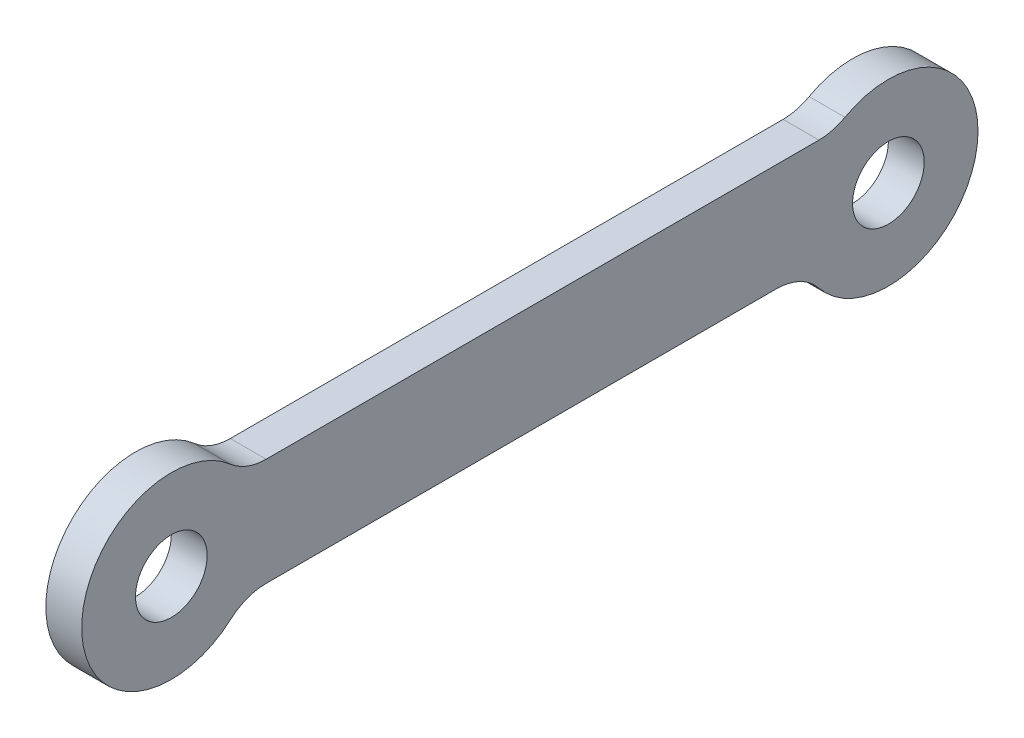
ISO-10303-21;
HEADER;
FILE_DESCRIPTION(('STEP AP214'),'2;1');
FILE_NAME('part.step','',(''),(''),'','','');
FILE_SCHEMA(('AUTOMOTIVE_DESIGN { 1 0 10303 214 1 1 1 1 }'));
ENDSEC;
DATA;
#1=APPLICATION_CONTEXT('core data for automotive mechanical design processes');
#2=APPLICATION_PROTOCOL_DEFINITION('international standard','automotive_design',2000,#1);
#3=PRODUCT_CONTEXT('',#1,'mechanical');
#4=PRODUCT('Part','Part','',(#3));
#5=PRODUCT_RELATED_PRODUCT_CATEGORY('part','',(#4));
#6=PRODUCT_DEFINITION_FORMATION('','',#4);
#7=PRODUCT_DEFINITION_CONTEXT('part definition',#1,'design');
#8=PRODUCT_DEFINITION('design','',#6,#7);
#9=PRODUCT_DEFINITION_SHAPE('','',#8);
#10=(LENGTH_UNIT() NAMED_UNIT(*) SI_UNIT(.MILLI.,.METRE.));
#11=(NAMED_UNIT(*) PLANE_ANGLE_UNIT() SI_UNIT($,.RADIAN.));
#12=(NAMED_UNIT(*) SI_UNIT($,.STERADIAN.) SOLID_ANGLE_UNIT());
#13=UNCERTAINTY_MEASURE_WITH_UNIT(LENGTH_MEASURE(1.E-05),#10,'distance_accuracy_value','');
#14=(GEOMETRIC_REPRESENTATION_CONTEXT(3) GLOBAL_UNCERTAINTY_ASSIGNED_CONTEXT((#13)) GLOBAL_UNIT_ASSIGNED_CONTEXT((#10,
#11,#12)) REPRESENTATION_CONTEXT('',''));
#15=CARTESIAN_POINT('',(0.,0.,0.));
#16=DIRECTION('',(0.,0.,1.));
#17=DIRECTION('',(1.,0.,0.));
#18=AXIS2_PLACEMENT_3D('',#15,#16,#17);
#19=CARTESIAN_POINT('',(0.,0.,0.));
#20=DIRECTION('',(1.,0.,0.));
#21=DIRECTION('',(0.,0.,-1.));
#22=AXIS2_PLACEMENT_3D('',#19,#20,#21);
#23=PLANE('',#22);
#24=CARTESIAN_POINT('',(0.,0.,0.));
#25=DIRECTION('',(1.,0.,0.));
#26=DIRECTION('',(0.,0.,-1.));
#27=AXIS2_PLACEMENT_3D('',#24,#25,#26);
#28=CIRCLE('',#27,2.);
#29=CARTESIAN_POINT('',(0.,0.,-2.));
#30=VERTEX_POINT('',#29);
#31=EDGE_CURVE('E270',#30,#30,#28,.T.);
#32=ORIENTED_EDGE('',*,*,#31,.T.);
#33=EDGE_LOOP('',(#32));
#34=FACE_BOUND('',#33,.T.);
#35=CARTESIAN_POINT('',(0.,-1.00000000000001,-40.));
#36=DIRECTION('',(1.,0.,0.));
#37=DIRECTION('',(0.,0.,-1.));
#38=AXIS2_PLACEMENT_3D('',#35,#36,#37);
#39=CIRCLE('',#38,2.);
#40=CARTESIAN_POINT('',(0.,-1.00000000000001,-42.));
#41=VERTEX_POINT('',#40);
#42=EDGE_CURVE('E273',#41,#41,#39,.T.);
#43=ORIENTED_EDGE('',*,*,#42,.T.);
#44=EDGE_LOOP('',(#43));
#45=FACE_BOUND('',#44,.T.);
#46=CARTESIAN_POINT('',(0.,0.,0.));
#47=DIRECTION('',(1.,0.,0.));
#48=DIRECTION('',(0.,0.,-1.));
#49=AXIS2_PLACEMENT_3D('',#46,#47,#48);
#50=CIRCLE('',#49,4.99999999999999);
#51=CARTESIAN_POINT('',(0.,3.74999999999999,-3.30718913883074));
#52=VERTEX_POINT('',#51);
#53=CARTESIAN_POINT('',(0.,-3.75,-3.30718913883072));
#54=VERTEX_POINT('',#53);
#55=EDGE_CURVE('E159',#52,#54,#50,.T.);
#56=ORIENTED_EDGE('',*,*,#55,.F.);
#57=CARTESIAN_POINT('',(0.,5.99999999999999,-5.29150262212918));
#58=DIRECTION('',(1.,0.,0.));
#59=DIRECTION('',(0.,0.,-1.));
#60=AXIS2_PLACEMENT_3D('',#57,#58,#59);
#61=CIRCLE('',#60,3.);
#62=CARTESIAN_POINT('',(0.,2.99999999999999,-5.29150262212918));
#63=VERTEX_POINT('',#62);
#64=EDGE_CURVE('E78',#52,#63,#61,.T.);
#65=ORIENTED_EDGE('',*,*,#64,.T.);
#66=DIRECTION('',(0.,0.,-1.));
#67=VECTOR('',#66,1.);
#68=CARTESIAN_POINT('',(0.,2.99999999999999,0.));
#69=LINE('',#68,#67);
#70=CARTESIAN_POINT('',(0.,2.99999999999999,-36.1270166537926));
#71=VERTEX_POINT('',#70);
#72=EDGE_CURVE('E286',#63,#71,#69,.T.);
#73=ORIENTED_EDGE('',*,*,#72,.T.);
#74=CARTESIAN_POINT('',(0.,5.99999999999999,-36.1270166537926));
#75=DIRECTION('',(1.,0.,0.));
#76=DIRECTION('',(0.,0.,-1.));
#77=AXIS2_PLACEMENT_3D('',#74,#75,#76);
#78=CIRCLE('',#77,3.);
#79=CARTESIAN_POINT('',(0.,3.375,-37.5793854086204));
#80=VERTEX_POINT('',#79);
#81=EDGE_CURVE('E85',#71,#80,#78,.T.);
#82=ORIENTED_EDGE('',*,*,#81,.T.);
#83=CARTESIAN_POINT('',(0.,-1.00000000000001,-40.));
#84=DIRECTION('',(1.,0.,0.));
#85=DIRECTION('',(0.,0.,-1.));
#86=AXIS2_PLACEMENT_3D('',#83,#84,#85);
#87=CIRCLE('',#86,5.);
#88=CARTESIAN_POINT('',(0.,-4.125,-36.096876251001));
#89=VERTEX_POINT('',#88);
#90=EDGE_CURVE('E272',#89,#80,#87,.T.);
#91=ORIENTED_EDGE('',*,*,#90,.F.);
#92=CARTESIAN_POINT('',(0.,-6.00000000000001,-33.7550020016016));
#93=DIRECTION('',(1.,0.,0.));
#94=DIRECTION('',(0.,0.,-1.));
#95=AXIS2_PLACEMENT_3D('',#92,#93,#94);
#96=CIRCLE('',#95,3.);
#97=CARTESIAN_POINT('',(0.,-3.00000000000001,-33.7550020016016));
#98=VERTEX_POINT('',#97);
#99=EDGE_CURVE('E147',#89,#98,#96,.T.);
#100=ORIENTED_EDGE('',*,*,#99,.T.);
#101=DIRECTION('',(0.,0.,-1.));
#102=VECTOR('',#101,1.);
#103=CARTESIAN_POINT('',(0.,-3.00000000000001,0.));
#104=LINE('',#103,#102);
#105=CARTESIAN_POINT('',(0.,-3.00000000000001,-5.29150262212916));
#106=VERTEX_POINT('',#105);
#107=EDGE_CURVE('E212',#106,#98,#104,.T.);
#108=ORIENTED_EDGE('',*,*,#107,.F.);
#109=CARTESIAN_POINT('',(0.,-6.00000000000001,-5.29150262212916));
#110=DIRECTION('',(1.,0.,0.));
#111=DIRECTION('',(0.,0.,-1.));
#112=AXIS2_PLACEMENT_3D('',#109,#110,#111);
#113=CIRCLE('',#112,3.);
#114=EDGE_CURVE('E148',#106,#54,#113,.T.);
#115=ORIENTED_EDGE('',*,*,#114,.T.);
#116=EDGE_LOOP('',(#56,#65,#73,#82,#91,#100,#108,#115));
#117=FACE_BOUND('',#116,.T.);
#118=ADVANCED_FACE('F69',(#34,#45,#117),#23,.F.);
#119=CARTESIAN_POINT('',(2.,0.,0.));
#120=DIRECTION('',(1.,0.,0.));
#121=DIRECTION('',(0.,0.,-1.));
#122=AXIS2_PLACEMENT_3D('',#119,#120,#121);
#123=PLANE('',#122);
#124=CARTESIAN_POINT('',(2.,0.,0.));
#125=DIRECTION('',(1.,0.,0.));
#126=DIRECTION('',(0.,0.,-1.));
#127=AXIS2_PLACEMENT_3D('',#124,#125,#126);
#128=CIRCLE('',#127,2.);
#129=CARTESIAN_POINT('',(2.,0.,-2.));
#130=VERTEX_POINT('',#129);
#131=EDGE_CURVE('E268',#130,#130,#128,.T.);
#132=ORIENTED_EDGE('',*,*,#131,.F.);
#133=EDGE_LOOP('',(#132));
#134=FACE_BOUND('',#133,.T.);
#135=CARTESIAN_POINT('',(2.,-1.00000000000001,-40.));
#136=DIRECTION('',(1.,0.,0.));
#137=DIRECTION('',(0.,0.,-1.));
#138=AXIS2_PLACEMENT_3D('',#135,#136,#137);
#139=CIRCLE('',#138,2.);
#140=CARTESIAN_POINT('',(2.,-1.00000000000001,-42.));
#141=VERTEX_POINT('',#140);
#142=EDGE_CURVE('E295',#141,#141,#139,.T.);
#143=ORIENTED_EDGE('',*,*,#142,.F.);
#144=EDGE_LOOP('',(#143));
#145=FACE_BOUND('',#144,.T.);
#146=DIRECTION('',(0.,0.,-1.));
#147=VECTOR('',#146,1.);
#148=CARTESIAN_POINT('',(2.,-3.00000000000001,0.));
#149=LINE('',#148,#147);
#150=CARTESIAN_POINT('',(2.,-3.00000000000001,-5.29150262212916));
#151=VERTEX_POINT('',#150);
#152=CARTESIAN_POINT('',(2.,-3.00000000000001,-33.7550020016016));
#153=VERTEX_POINT('',#152);
#154=EDGE_CURVE('E139',#151,#153,#149,.T.);
#155=ORIENTED_EDGE('',*,*,#154,.T.);
#156=CARTESIAN_POINT('',(2.,-6.00000000000001,-33.7550020016016));
#157=DIRECTION('',(1.,0.,0.));
#158=DIRECTION('',(0.,0.,-1.));
#159=AXIS2_PLACEMENT_3D('',#156,#157,#158);
#160=CIRCLE('',#159,3.);
#161=CARTESIAN_POINT('',(2.,-4.125,-36.096876251001));
#162=VERTEX_POINT('',#161);
#163=EDGE_CURVE('E193',#153,#162,#160,.F.);
#164=ORIENTED_EDGE('',*,*,#163,.T.);
#165=CARTESIAN_POINT('',(2.,-1.00000000000001,-40.));
#166=DIRECTION('',(1.,0.,0.));
#167=DIRECTION('',(0.,0.,-1.));
#168=AXIS2_PLACEMENT_3D('',#165,#166,#167);
#169=CIRCLE('',#168,5.);
#170=CARTESIAN_POINT('',(2.,3.375,-37.5793854086204));
#171=VERTEX_POINT('',#170);
#172=EDGE_CURVE('E207',#162,#171,#169,.T.);
#173=ORIENTED_EDGE('',*,*,#172,.T.);
#174=CARTESIAN_POINT('',(2.,5.99999999999999,-36.1270166537926));
#175=DIRECTION('',(1.,0.,0.));
#176=DIRECTION('',(0.,0.,-1.));
#177=AXIS2_PLACEMENT_3D('',#174,#175,#176);
#178=CIRCLE('',#177,3.);
#179=CARTESIAN_POINT('',(2.,2.99999999999999,-36.1270166537926));
#180=VERTEX_POINT('',#179);
#181=EDGE_CURVE('E198',#171,#180,#178,.F.);
#182=ORIENTED_EDGE('',*,*,#181,.T.);
#183=DIRECTION('',(0.,0.,-1.));
#184=VECTOR('',#183,1.);
#185=CARTESIAN_POINT('',(2.,2.99999999999999,0.));
#186=LINE('',#185,#184);
#187=CARTESIAN_POINT('',(2.,2.99999999999999,-5.29150262212918));
#188=VERTEX_POINT('',#187);
#189=EDGE_CURVE('E160',#188,#180,#186,.T.);
#190=ORIENTED_EDGE('',*,*,#189,.F.);
#191=CARTESIAN_POINT('',(2.,5.99999999999999,-5.29150262212918));
#192=DIRECTION('',(1.,0.,0.));
#193=DIRECTION('',(0.,0.,-1.));
#194=AXIS2_PLACEMENT_3D('',#191,#192,#193);
#195=CIRCLE('',#194,3.);
#196=CARTESIAN_POINT('',(2.,3.74999999999999,-3.30718913883074));
#197=VERTEX_POINT('',#196);
#198=EDGE_CURVE('E12',#188,#197,#195,.F.);
#199=ORIENTED_EDGE('',*,*,#198,.T.);
#200=CARTESIAN_POINT('',(2.,0.,0.));
#201=DIRECTION('',(1.,0.,0.));
#202=DIRECTION('',(0.,0.,-1.));
#203=AXIS2_PLACEMENT_3D('',#200,#201,#202);
#204=CIRCLE('',#203,4.99999999999999);
#205=CARTESIAN_POINT('',(2.,-3.75,-3.30718913883072));
#206=VERTEX_POINT('',#205);
#207=EDGE_CURVE('E142',#197,#206,#204,.T.);
#208=ORIENTED_EDGE('',*,*,#207,.T.);
#209=CARTESIAN_POINT('',(2.,-6.00000000000001,-5.29150262212916));
#210=DIRECTION('',(1.,0.,0.));
#211=DIRECTION('',(0.,0.,-1.));
#212=AXIS2_PLACEMENT_3D('',#209,#210,#211);
#213=CIRCLE('',#212,3.);
#214=EDGE_CURVE('E136',#206,#151,#213,.F.);
#215=ORIENTED_EDGE('',*,*,#214,.T.);
#216=EDGE_LOOP('',(#155,#164,#173,#182,#190,#199,#208,#215));
#217=FACE_BOUND('',#216,.T.);
#218=ADVANCED_FACE('F138',(#134,#145,#217),#123,.T.);
#219=CARTESIAN_POINT('',(2.,0.,0.));
#220=DIRECTION('',(-1.,0.,0.));
#221=DIRECTION('',(0.,0.,1.));
#222=AXIS2_PLACEMENT_3D('',#219,#220,#221);
#223=CYLINDRICAL_SURFACE('',#222,4.99999999999999);
#224=ORIENTED_EDGE('',*,*,#55,.T.);
#225=DIRECTION('',(-1.,0.,0.));
#226=VECTOR('',#225,1.);
#227=CARTESIAN_POINT('',(2.,-3.75,-3.30718913883072));
#228=LINE('',#227,#226);
#229=EDGE_CURVE('E169',#54,#206,#228,.F.);
#230=ORIENTED_EDGE('',*,*,#229,.T.);
#231=ORIENTED_EDGE('',*,*,#207,.F.);
#232=DIRECTION('',(-1.,0.,0.));
#233=VECTOR('',#232,1.);
#234=CARTESIAN_POINT('',(2.,3.74999999999999,-3.30718913883074));
#235=LINE('',#234,#233);
#236=EDGE_CURVE('E164',#197,#52,#235,.T.);
#237=ORIENTED_EDGE('',*,*,#236,.T.);
#238=EDGE_LOOP('',(#224,#230,#231,#237));
#239=FACE_BOUND('',#238,.T.);
#240=ADVANCED_FACE('F227',(#239),#223,.T.);
#241=CARTESIAN_POINT('',(2.,-1.00000000000001,-40.));
#242=DIRECTION('',(-1.,0.,0.));
#243=DIRECTION('',(0.,0.,1.));
#244=AXIS2_PLACEMENT_3D('',#241,#242,#243);
#245=CYLINDRICAL_SURFACE('',#244,5.);
#246=ORIENTED_EDGE('',*,*,#172,.F.);
#247=DIRECTION('',(-1.,0.,0.));
#248=VECTOR('',#247,1.);
#249=CARTESIAN_POINT('',(2.,-4.12500000000001,-36.096876251001));
#250=LINE('',#249,#248);
#251=EDGE_CURVE('E179',#162,#89,#250,.T.);
#252=ORIENTED_EDGE('',*,*,#251,.T.);
#253=ORIENTED_EDGE('',*,*,#90,.T.);
#254=DIRECTION('',(-1.,0.,0.));
#255=VECTOR('',#254,1.);
#256=CARTESIAN_POINT('',(2.,3.375,-37.5793854086204));
#257=LINE('',#256,#255);
#258=EDGE_CURVE('E176',#80,#171,#257,.F.);
#259=ORIENTED_EDGE('',*,*,#258,.T.);
#260=EDGE_LOOP('',(#246,#252,#253,#259));
#261=FACE_BOUND('',#260,.T.);
#262=ADVANCED_FACE('F234',(#261),#245,.T.);
#263=CARTESIAN_POINT('',(2.,2.99999999999999,0.));
#264=DIRECTION('',(0.,1.,0.));
#265=DIRECTION('',(0.,0.,1.));
#266=AXIS2_PLACEMENT_3D('',#263,#264,#265);
#267=PLANE('',#266);
#268=ORIENTED_EDGE('',*,*,#189,.T.);
#269=DIRECTION('',(-1.,0.,0.));
#270=VECTOR('',#269,1.);
#271=CARTESIAN_POINT('',(2.,2.99999999999999,-36.1270166537926));
#272=LINE('',#271,#270);
#273=EDGE_CURVE('E186',#180,#71,#272,.T.);
#274=ORIENTED_EDGE('',*,*,#273,.T.);
#275=ORIENTED_EDGE('',*,*,#72,.F.);
#276=DIRECTION('',(-1.,0.,0.));
#277=VECTOR('',#276,1.);
#278=CARTESIAN_POINT('',(2.,2.99999999999999,-5.29150262212918));
#279=LINE('',#278,#277);
#280=EDGE_CURVE('E183',#63,#188,#279,.F.);
#281=ORIENTED_EDGE('',*,*,#280,.T.);
#282=EDGE_LOOP('',(#268,#274,#275,#281));
#283=FACE_BOUND('',#282,.T.);
#284=ADVANCED_FACE('F209',(#283),#267,.T.);
#285=CARTESIAN_POINT('',(2.,-3.00000000000001,0.));
#286=DIRECTION('',(0.,1.,0.));
#287=DIRECTION('',(0.,0.,1.));
#288=AXIS2_PLACEMENT_3D('',#285,#286,#287);
#289=PLANE('',#288);
#290=ORIENTED_EDGE('',*,*,#154,.F.);
#291=DIRECTION('',(1.,0.,0.));
#292=VECTOR('',#291,1.);
#293=CARTESIAN_POINT('',(0.,-3.00000000000001,-5.29150262212916));
#294=LINE('',#293,#292);
#295=EDGE_CURVE('E154',#151,#106,#294,.F.);
#296=ORIENTED_EDGE('',*,*,#295,.T.);
#297=ORIENTED_EDGE('',*,*,#107,.T.);
#298=DIRECTION('',(1.,0.,0.));
#299=VECTOR('',#298,1.);
#300=CARTESIAN_POINT('',(2.,-3.00000000000001,-33.7550020016016));
#301=LINE('',#300,#299);
#302=EDGE_CURVE('E157',#98,#153,#301,.T.);
#303=ORIENTED_EDGE('',*,*,#302,.T.);
#304=EDGE_LOOP('',(#290,#296,#297,#303));
#305=FACE_BOUND('',#304,.T.);
#306=ADVANCED_FACE('F152',(#305),#289,.F.);
#307=CARTESIAN_POINT('',(-1.2E-05,-1.00000000000001,-40.));
#308=DIRECTION('',(1.,0.,0.));
#309=DIRECTION('',(0.,0.,-1.));
#310=AXIS2_PLACEMENT_3D('',#307,#308,#309);
#311=CYLINDRICAL_SURFACE('',#310,2.);
#312=CARTESIAN_POINT('',(2.,-1.00000000000001,-42.));
#313=CARTESIAN_POINT('',(1.97916666666667,-1.00000000000001,-42.));
#314=CARTESIAN_POINT('',(1.95833333333333,-1.00000000000001,-42.));
#315=CARTESIAN_POINT('',(1.91666666666667,-1.00000000000001,-42.));
#316=CARTESIAN_POINT('',(1.89583333333333,-1.00000000000001,-42.));
#317=CARTESIAN_POINT('',(1.85416666666667,-1.00000000000001,-42.));
#318=CARTESIAN_POINT('',(1.83333333333333,-1.00000000000001,-42.));
#319=CARTESIAN_POINT('',(1.79166666666667,-1.00000000000001,-42.));
#320=CARTESIAN_POINT('',(1.77083333333333,-1.00000000000001,-42.));
#321=CARTESIAN_POINT('',(1.72916666666667,-1.00000000000001,-42.));
#322=CARTESIAN_POINT('',(1.70833333333333,-1.00000000000001,-42.));
#323=CARTESIAN_POINT('',(1.66666666666667,-1.00000000000001,-42.));
#324=CARTESIAN_POINT('',(1.64583333333333,-1.00000000000001,-42.));
#325=CARTESIAN_POINT('',(1.60416666666667,-1.00000000000001,-42.));
#326=CARTESIAN_POINT('',(1.58333333333333,-1.00000000000001,-42.));
#327=CARTESIAN_POINT('',(1.54166666666667,-1.00000000000001,-42.));
#328=CARTESIAN_POINT('',(1.52083333333333,-1.00000000000001,-42.));
#329=CARTESIAN_POINT('',(1.47916666666667,-1.00000000000001,-42.));
#330=CARTESIAN_POINT('',(1.45833333333333,-1.00000000000001,-42.));
#331=CARTESIAN_POINT('',(1.41666666666667,-1.00000000000001,-42.));
#332=CARTESIAN_POINT('',(1.39583333333333,-1.00000000000001,-42.));
#333=CARTESIAN_POINT('',(1.35416666666667,-1.00000000000001,-42.));
#334=CARTESIAN_POINT('',(1.33333333333333,-1.00000000000001,-42.));
#335=CARTESIAN_POINT('',(1.29166666666667,-1.00000000000001,-42.));
#336=CARTESIAN_POINT('',(1.27083333333333,-1.00000000000001,-42.));
#337=CARTESIAN_POINT('',(1.22916666666667,-1.00000000000001,-42.));
#338=CARTESIAN_POINT('',(1.20833333333333,-1.00000000000001,-42.));
#339=CARTESIAN_POINT('',(1.16666666666667,-1.00000000000001,-42.));
#340=CARTESIAN_POINT('',(1.14583333333333,-1.00000000000001,-42.));
#341=CARTESIAN_POINT('',(1.10416666666667,-1.00000000000001,-42.));
#342=CARTESIAN_POINT('',(1.08333333333333,-1.00000000000001,-42.));
#343=CARTESIAN_POINT('',(1.04166666666667,-1.00000000000001,-42.));
#344=CARTESIAN_POINT('',(1.02083333333333,-1.00000000000001,-42.));
#345=CARTESIAN_POINT('',(0.979166666666667,-1.00000000000001,-42.));
#346=CARTESIAN_POINT('',(0.958333333333334,-1.00000000000001,-42.));
#347=CARTESIAN_POINT('',(0.916666666666667,-1.00000000000001,-42.));
#348=CARTESIAN_POINT('',(0.895833333333334,-1.00000000000001,-42.));
#349=CARTESIAN_POINT('',(0.854166666666667,-1.00000000000001,-42.));
#350=CARTESIAN_POINT('',(0.833333333333334,-1.00000000000001,-42.));
#351=CARTESIAN_POINT('',(0.791666666666667,-1.00000000000001,-42.));
#352=CARTESIAN_POINT('',(0.770833333333334,-1.00000000000001,-42.));
#353=CARTESIAN_POINT('',(0.729166666666667,-1.00000000000001,-42.));
#354=CARTESIAN_POINT('',(0.708333333333334,-1.00000000000001,-42.));
#355=CARTESIAN_POINT('',(0.666666666666667,-1.00000000000001,-42.));
#356=CARTESIAN_POINT('',(0.645833333333334,-1.00000000000001,-42.));
#357=CARTESIAN_POINT('',(0.604166666666667,-1.00000000000001,-42.));
#358=CARTESIAN_POINT('',(0.583333333333333,-1.00000000000001,-42.));
#359=CARTESIAN_POINT('',(0.541666666666667,-1.00000000000001,-42.));
#360=CARTESIAN_POINT('',(0.520833333333333,-1.00000000000001,-42.));
#361=CARTESIAN_POINT('',(0.479166666666667,-1.00000000000001,-42.));
#362=CARTESIAN_POINT('',(0.458333333333334,-1.00000000000001,-42.));
#363=CARTESIAN_POINT('',(0.416666666666667,-1.00000000000001,-42.));
#364=CARTESIAN_POINT('',(0.395833333333334,-1.00000000000001,-42.));
#365=CARTESIAN_POINT('',(0.354166666666667,-1.00000000000001,-42.));
#366=CARTESIAN_POINT('',(0.333333333333334,-1.00000000000001,-42.));
#367=CARTESIAN_POINT('',(0.291666666666667,-1.00000000000001,-42.));
#368=CARTESIAN_POINT('',(0.270833333333333,-1.00000000000001,-42.));
#369=CARTESIAN_POINT('',(0.229166666666667,-1.00000000000001,-42.));
#370=CARTESIAN_POINT('',(0.208333333333333,-1.00000000000001,-42.));
#371=CARTESIAN_POINT('',(0.166666666666667,-1.00000000000001,-42.));
#372=CARTESIAN_POINT('',(0.145833333333334,-1.00000000000001,-42.));
#373=CARTESIAN_POINT('',(0.104166666666667,-1.00000000000001,-42.));
#374=CARTESIAN_POINT('',(0.0833333333333336,-1.00000000000001,-42.));
#375=CARTESIAN_POINT('',(0.0416666666666669,-1.00000000000001,-42.));
#376=CARTESIAN_POINT('',(0.0208333333333335,-1.00000000000001,-42.));
#377=CARTESIAN_POINT('',(0.,-1.00000000000001,-42.));
#378=B_SPLINE_CURVE_WITH_KNOTS('',3,(#312,#313,#314,#315,#316,#317,#318,#319,#320,#321,#322,
#323,#324,#325,#326,#327,#328,#329,#330,#331,#332,#333,#334,#335,#336,#337,#338,#339,#340,#341,
#342,#343,#344,#345,#346,#347,#348,#349,#350,#351,#352,#353,#354,#355,#356,#357,#358,#359,#360,
#361,#362,#363,#364,#365,#366,#367,#368,#369,#370,#371,#372,#373,#374,#375,#376,#377),
.UNSPECIFIED.,.F.,.F.,(4,2,2,2,2,2,2,2,2,2,2,2,2,2,2,2,2,2,2,2,2,2,2,2,2,2,2,2,2,2,2,2,4),(0.,
0.0624999999999996,0.125,0.1875,0.25,0.3125,0.375,0.4375,0.5,0.5625,0.625,0.6875,0.75,0.8125,
0.875,0.9375,1.,1.0625,1.125,1.1875,1.25,1.3125,1.375,1.4375,1.5,1.5625,1.625,1.6875,1.75,
1.8125,1.875,1.9375,2.),.UNSPECIFIED.);
#379=EDGE_CURVE('BSEAM233',#141,#41,#378,.T.);
#380=ORIENTED_EDGE('',*,*,#142,.T.);
#381=ORIENTED_EDGE('',*,*,#42,.F.);
#382=ORIENTED_EDGE('',*,*,#379,.T.);
#383=ORIENTED_EDGE('',*,*,#379,.F.);
#384=EDGE_LOOP('',(#380,#382,#381,#383));
#385=FACE_BOUND('',#384,.T.);
#386=ADVANCED_FACE('F233',(#385),#311,.F.);
#387=CARTESIAN_POINT('',(-1.2E-05,0.,0.));
#388=DIRECTION('',(1.,0.,0.));
#389=DIRECTION('',(0.,0.,-1.));
#390=AXIS2_PLACEMENT_3D('',#387,#388,#389);
#391=CYLINDRICAL_SURFACE('',#390,2.);
#392=CARTESIAN_POINT('',(2.,0.,-2.));
#393=CARTESIAN_POINT('',(1.97916666666667,0.,-2.));
#394=CARTESIAN_POINT('',(1.95833333333333,0.,-2.));
#395=CARTESIAN_POINT('',(1.91666666666667,0.,-2.));
#396=CARTESIAN_POINT('',(1.89583333333333,0.,-2.));
#397=CARTESIAN_POINT('',(1.85416666666667,0.,-2.));
#398=CARTESIAN_POINT('',(1.83333333333333,0.,-2.));
#399=CARTESIAN_POINT('',(1.79166666666667,0.,-2.));
#400=CARTESIAN_POINT('',(1.77083333333333,0.,-2.));
#401=CARTESIAN_POINT('',(1.72916666666667,0.,-2.));
#402=CARTESIAN_POINT('',(1.70833333333333,0.,-2.));
#403=CARTESIAN_POINT('',(1.66666666666667,0.,-2.));
#404=CARTESIAN_POINT('',(1.64583333333333,0.,-2.));
#405=CARTESIAN_POINT('',(1.60416666666667,0.,-2.));
#406=CARTESIAN_POINT('',(1.58333333333333,0.,-2.));
#407=CARTESIAN_POINT('',(1.54166666666667,0.,-2.));
#408=CARTESIAN_POINT('',(1.52083333333333,0.,-2.));
#409=CARTESIAN_POINT('',(1.47916666666667,0.,-2.));
#410=CARTESIAN_POINT('',(1.45833333333333,0.,-2.));
#411=CARTESIAN_POINT('',(1.41666666666667,0.,-2.));
#412=CARTESIAN_POINT('',(1.39583333333333,0.,-2.));
#413=CARTESIAN_POINT('',(1.35416666666667,0.,-2.));
#414=CARTESIAN_POINT('',(1.33333333333333,0.,-2.));
#415=CARTESIAN_POINT('',(1.29166666666667,0.,-2.));
#416=CARTESIAN_POINT('',(1.27083333333333,0.,-2.));
#417=CARTESIAN_POINT('',(1.22916666666667,0.,-2.));
#418=CARTESIAN_POINT('',(1.20833333333333,0.,-2.));
#419=CARTESIAN_POINT('',(1.16666666666667,0.,-2.));
#420=CARTESIAN_POINT('',(1.14583333333333,0.,-2.));
#421=CARTESIAN_POINT('',(1.10416666666667,0.,-2.));
#422=CARTESIAN_POINT('',(1.08333333333333,0.,-2.));
#423=CARTESIAN_POINT('',(1.04166666666667,0.,-2.));
#424=CARTESIAN_POINT('',(1.02083333333333,0.,-2.));
#425=CARTESIAN_POINT('',(0.979166666666667,0.,-2.));
#426=CARTESIAN_POINT('',(0.958333333333334,0.,-2.));
#427=CARTESIAN_POINT('',(0.916666666666667,0.,-2.));
#428=CARTESIAN_POINT('',(0.895833333333334,0.,-2.));
#429=CARTESIAN_POINT('',(0.854166666666667,0.,-2.));
#430=CARTESIAN_POINT('',(0.833333333333334,0.,-2.));
#431=CARTESIAN_POINT('',(0.791666666666667,0.,-2.));
#432=CARTESIAN_POINT('',(0.770833333333334,0.,-2.));
#433=CARTESIAN_POINT('',(0.729166666666667,0.,-2.));
#434=CARTESIAN_POINT('',(0.708333333333334,0.,-2.));
#435=CARTESIAN_POINT('',(0.666666666666667,0.,-2.));
#436=CARTESIAN_POINT('',(0.645833333333334,0.,-2.));
#437=CARTESIAN_POINT('',(0.604166666666667,0.,-2.));
#438=CARTESIAN_POINT('',(0.583333333333333,0.,-2.));
#439=CARTESIAN_POINT('',(0.541666666666667,0.,-2.));
#440=CARTESIAN_POINT('',(0.520833333333333,0.,-2.));
#441=CARTESIAN_POINT('',(0.479166666666667,0.,-2.));
#442=CARTESIAN_POINT('',(0.458333333333334,0.,-2.));
#443=CARTESIAN_POINT('',(0.416666666666667,0.,-2.));
#444=CARTESIAN_POINT('',(0.395833333333334,0.,-2.));
#445=CARTESIAN_POINT('',(0.354166666666667,0.,-2.));
#446=CARTESIAN_POINT('',(0.333333333333334,0.,-2.));
#447=CARTESIAN_POINT('',(0.291666666666667,0.,-2.));
#448=CARTESIAN_POINT('',(0.270833333333333,0.,-2.));
#449=CARTESIAN_POINT('',(0.229166666666667,0.,-2.));
#450=CARTESIAN_POINT('',(0.208333333333333,0.,-2.));
#451=CARTESIAN_POINT('',(0.166666666666667,0.,-2.));
#452=CARTESIAN_POINT('',(0.145833333333334,0.,-2.));
#453=CARTESIAN_POINT('',(0.104166666666667,0.,-2.));
#454=CARTESIAN_POINT('',(0.0833333333333336,0.,-2.));
#455=CARTESIAN_POINT('',(0.0416666666666669,0.,-2.));
#456=CARTESIAN_POINT('',(0.0208333333333335,0.,-2.));
#457=CARTESIAN_POINT('',(0.,0.,-2.));
#458=B_SPLINE_CURVE_WITH_KNOTS('',3,(#392,#393,#394,#395,#396,#397,#398,#399,#400,#401,#402,
#403,#404,#405,#406,#407,#408,#409,#410,#411,#412,#413,#414,#415,#416,#417,#418,#419,#420,#421,
#422,#423,#424,#425,#426,#427,#428,#429,#430,#431,#432,#433,#434,#435,#436,#437,#438,#439,#440,
#441,#442,#443,#444,#445,#446,#447,#448,#449,#450,#451,#452,#453,#454,#455,#456,#457),
.UNSPECIFIED.,.F.,.F.,(4,2,2,2,2,2,2,2,2,2,2,2,2,2,2,2,2,2,2,2,2,2,2,2,2,2,2,2,2,2,2,2,4),(0.,
0.0624999999999996,0.125,0.1875,0.25,0.3125,0.375,0.4375,0.5,0.5625,0.625,0.6875,0.75,0.8125,
0.875,0.9375,1.,1.0625,1.125,1.1875,1.25,1.3125,1.375,1.4375,1.5,1.5625,1.625,1.6875,1.75,
1.8125,1.875,1.9375,2.),.UNSPECIFIED.);
#459=EDGE_CURVE('BSEAM252',#130,#30,#458,.T.);
#460=ORIENTED_EDGE('',*,*,#131,.T.);
#461=ORIENTED_EDGE('',*,*,#31,.F.);
#462=ORIENTED_EDGE('',*,*,#459,.T.);
#463=ORIENTED_EDGE('',*,*,#459,.F.);
#464=EDGE_LOOP('',(#460,#462,#461,#463));
#465=FACE_BOUND('',#464,.T.);
#466=ADVANCED_FACE('F252',(#465),#391,.F.);
#467=CARTESIAN_POINT('',(2.,-6.00000000000001,-5.29150262212916));
#468=DIRECTION('',(-1.,0.,0.));
#469=DIRECTION('',(0.,0.,1.));
#470=AXIS2_PLACEMENT_3D('',#467,#468,#469);
#471=CYLINDRICAL_SURFACE('',#470,3.);
#472=ORIENTED_EDGE('',*,*,#214,.F.);
#473=ORIENTED_EDGE('',*,*,#229,.F.);
#474=ORIENTED_EDGE('',*,*,#114,.F.);
#475=ORIENTED_EDGE('',*,*,#295,.F.);
#476=EDGE_LOOP('',(#472,#473,#474,#475));
#477=FACE_BOUND('',#476,.T.);
#478=ADVANCED_FACE('F162',(#477),#471,.F.);
#479=CARTESIAN_POINT('',(2.,-6.00000000000001,-33.7550020016016));
#480=DIRECTION('',(-1.,0.,0.));
#481=DIRECTION('',(0.,0.,1.));
#482=AXIS2_PLACEMENT_3D('',#479,#480,#481);
#483=CYLINDRICAL_SURFACE('',#482,3.);
#484=ORIENTED_EDGE('',*,*,#163,.F.);
#485=ORIENTED_EDGE('',*,*,#302,.F.);
#486=ORIENTED_EDGE('',*,*,#99,.F.);
#487=ORIENTED_EDGE('',*,*,#251,.F.);
#488=EDGE_LOOP('',(#484,#485,#486,#487));
#489=FACE_BOUND('',#488,.T.);
#490=ADVANCED_FACE('F216',(#489),#483,.F.);
#491=CARTESIAN_POINT('',(2.,5.99999999999999,-36.1270166537926));
#492=DIRECTION('',(-1.,0.,0.));
#493=DIRECTION('',(0.,0.,1.));
#494=AXIS2_PLACEMENT_3D('',#491,#492,#493);
#495=CYLINDRICAL_SURFACE('',#494,3.);
#496=ORIENTED_EDGE('',*,*,#181,.F.);
#497=ORIENTED_EDGE('',*,*,#258,.F.);
#498=ORIENTED_EDGE('',*,*,#81,.F.);
#499=ORIENTED_EDGE('',*,*,#273,.F.);
#500=EDGE_LOOP('',(#496,#497,#498,#499));
#501=FACE_BOUND('',#500,.T.);
#502=ADVANCED_FACE('F214',(#501),#495,.F.);
#503=CARTESIAN_POINT('',(2.,5.99999999999999,-5.29150262212918));
#504=DIRECTION('',(-1.,0.,0.));
#505=DIRECTION('',(0.,0.,1.));
#506=AXIS2_PLACEMENT_3D('',#503,#504,#505);
#507=CYLINDRICAL_SURFACE('',#506,3.);
#508=ORIENTED_EDGE('',*,*,#198,.F.);
#509=ORIENTED_EDGE('',*,*,#280,.F.);
#510=ORIENTED_EDGE('',*,*,#64,.F.);
#511=ORIENTED_EDGE('',*,*,#236,.F.);
#512=EDGE_LOOP('',(#508,#509,#510,#511));
#513=FACE_BOUND('',#512,.T.);
#514=ADVANCED_FACE('F71',(#513),#507,.F.);
#515=CLOSED_SHELL('',(#118,#218,#240,#262,#284,#306,#386,#466,#478,#490,#502,#514));
#516=MANIFOLD_SOLID_BREP('B2',#515);
#517=ADVANCED_BREP_SHAPE_REPRESENTATION('',(#18,#516),#14);
#518=SHAPE_DEFINITION_REPRESENTATION(#9,#517);
ENDSEC;
END-ISO-10303-21;
